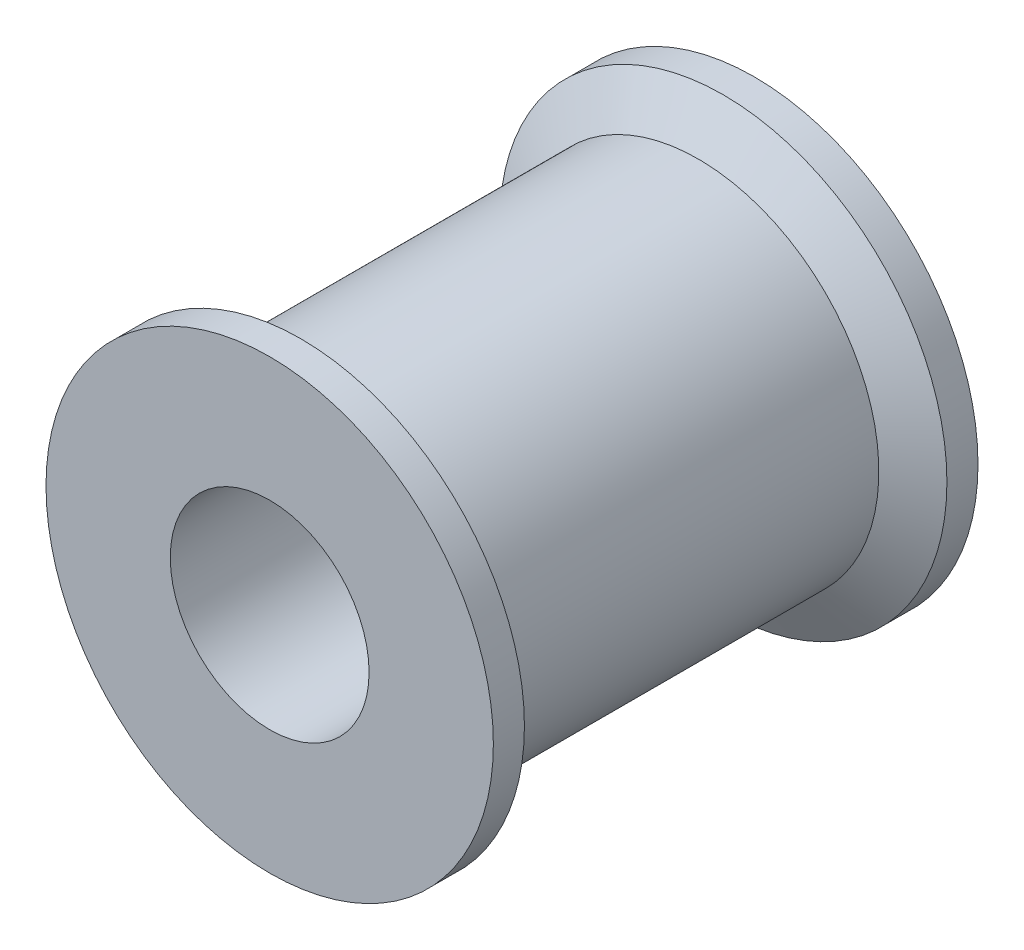
ISO-10303-21;
HEADER;
FILE_DESCRIPTION(('STEP AP214'),'2;1');
FILE_NAME('part.step','',(''),(''),'','','');
FILE_SCHEMA(('AUTOMOTIVE_DESIGN { 1 0 10303 214 1 1 1 1 }'));
ENDSEC;
DATA;
#1=APPLICATION_CONTEXT('core data for automotive mechanical design processes');
#2=APPLICATION_PROTOCOL_DEFINITION('international standard','automotive_design',2000,#1);
#3=PRODUCT_CONTEXT('',#1,'mechanical');
#4=PRODUCT('Part','Part','',(#3));
#5=PRODUCT_RELATED_PRODUCT_CATEGORY('part','',(#4));
#6=PRODUCT_DEFINITION_FORMATION('','',#4);
#7=PRODUCT_DEFINITION_CONTEXT('part definition',#1,'design');
#8=PRODUCT_DEFINITION('design','',#6,#7);
#9=PRODUCT_DEFINITION_SHAPE('','',#8);
#10=(LENGTH_UNIT() NAMED_UNIT(*) SI_UNIT(.MILLI.,.METRE.));
#11=(NAMED_UNIT(*) PLANE_ANGLE_UNIT() SI_UNIT($,.RADIAN.));
#12=(NAMED_UNIT(*) SI_UNIT($,.STERADIAN.) SOLID_ANGLE_UNIT());
#13=UNCERTAINTY_MEASURE_WITH_UNIT(LENGTH_MEASURE(1.E-05),#10,'distance_accuracy_value','');
#14=(GEOMETRIC_REPRESENTATION_CONTEXT(3) GLOBAL_UNCERTAINTY_ASSIGNED_CONTEXT((#13)) GLOBAL_UNIT_ASSIGNED_CONTEXT((#10,
#11,#12)) REPRESENTATION_CONTEXT('',''));
#15=CARTESIAN_POINT('',(0.,0.,0.));
#16=DIRECTION('',(0.,0.,1.));
#17=DIRECTION('',(1.,0.,0.));
#18=AXIS2_PLACEMENT_3D('',#15,#16,#17);
#19=CARTESIAN_POINT('',(0.,0.,23.75));
#20=DIRECTION('',(0.,0.,1.));
#21=DIRECTION('',(1.,0.,0.));
#22=AXIS2_PLACEMENT_3D('',#19,#20,#21);
#23=CONICAL_SURFACE('',#22,7.26,1.04917802969851);
#24=CARTESIAN_POINT('',(0.,0.,24.75));
#25=DIRECTION('',(0.,0.,-1.));
#26=DIRECTION('',(-1.,0.,0.));
#27=AXIS2_PLACEMENT_3D('',#24,#25,#26);
#28=CIRCLE('',#27,8.99999999999999);
#29=CARTESIAN_POINT('',(-8.99999999999999,0.,24.75));
#30=VERTEX_POINT('',#29);
#31=EDGE_CURVE('E10',#30,#30,#28,.T.);
#32=ORIENTED_EDGE('',*,*,#31,.T.);
#33=EDGE_LOOP('',(#32));
#34=FACE_BOUND('',#33,.T.);
#35=CARTESIAN_POINT('',(0.,0.,23.75));
#36=DIRECTION('',(0.,0.,-1.));
#37=DIRECTION('',(-1.,0.,0.));
#38=AXIS2_PLACEMENT_3D('',#35,#36,#37);
#39=CIRCLE('',#38,7.26);
#40=CARTESIAN_POINT('',(-7.26,0.,23.75));
#41=VERTEX_POINT('',#40);
#42=EDGE_CURVE('E55',#41,#41,#39,.T.);
#43=ORIENTED_EDGE('',*,*,#42,.F.);
#44=EDGE_LOOP('',(#43));
#45=FACE_BOUND('',#44,.T.);
#46=ADVANCED_FACE('F30',(#34,#45),#23,.T.);
#47=CARTESIAN_POINT('',(0.,0.,0.));
#48=DIRECTION('',(0.,0.,-1.));
#49=DIRECTION('',(-1.,0.,0.));
#50=AXIS2_PLACEMENT_3D('',#47,#48,#49);
#51=CYLINDRICAL_SURFACE('',#50,8.99999999999999);
#52=CARTESIAN_POINT('',(0.,0.,26.));
#53=DIRECTION('',(0.,0.,-1.));
#54=DIRECTION('',(-1.,0.,0.));
#55=AXIS2_PLACEMENT_3D('',#52,#53,#54);
#56=CIRCLE('',#55,9.);
#57=CARTESIAN_POINT('',(-9.,0.,26.));
#58=VERTEX_POINT('',#57);
#59=EDGE_CURVE('E36',#58,#58,#56,.T.);
#60=ORIENTED_EDGE('',*,*,#59,.T.);
#61=EDGE_LOOP('',(#60));
#62=FACE_BOUND('',#61,.T.);
#63=ORIENTED_EDGE('',*,*,#31,.F.);
#64=EDGE_LOOP('',(#63));
#65=FACE_BOUND('',#64,.T.);
#66=ADVANCED_FACE('F73',(#62,#65),#51,.T.);
#67=CARTESIAN_POINT('',(0.,9.,26.));
#68=DIRECTION('',(0.,0.,1.));
#69=DIRECTION('',(1.,0.,0.));
#70=AXIS2_PLACEMENT_3D('',#67,#68,#69);
#71=PLANE('',#70);
#72=CARTESIAN_POINT('',(0.,0.,26.));
#73=DIRECTION('',(0.,0.,-1.));
#74=DIRECTION('',(-1.,0.,0.));
#75=AXIS2_PLACEMENT_3D('',#72,#73,#74);
#76=CIRCLE('',#75,4.);
#77=CARTESIAN_POINT('',(-4.,0.,26.));
#78=VERTEX_POINT('',#77);
#79=EDGE_CURVE('E40',#78,#78,#76,.T.);
#80=ORIENTED_EDGE('',*,*,#79,.T.);
#81=EDGE_LOOP('',(#80));
#82=FACE_BOUND('',#81,.T.);
#83=ORIENTED_EDGE('',*,*,#59,.F.);
#84=EDGE_LOOP('',(#83));
#85=FACE_BOUND('',#84,.T.);
#86=ADVANCED_FACE('F67',(#82,#85),#71,.T.);
#87=CARTESIAN_POINT('',(0.,0.,0.));
#88=DIRECTION('',(0.,0.,-1.));
#89=DIRECTION('',(-1.,0.,0.));
#90=AXIS2_PLACEMENT_3D('',#87,#88,#89);
#91=CYLINDRICAL_SURFACE('',#90,4.);
#92=CARTESIAN_POINT('',(0.,0.,6.5));
#93=DIRECTION('',(0.,0.,1.));
#94=DIRECTION('',(1.,0.,0.));
#95=AXIS2_PLACEMENT_3D('',#92,#93,#94);
#96=CIRCLE('',#95,4.);
#97=CARTESIAN_POINT('',(4.,0.,6.5));
#98=VERTEX_POINT('',#97);
#99=EDGE_CURVE('E58',#98,#98,#96,.T.);
#100=ORIENTED_EDGE('',*,*,#99,.F.);
#101=EDGE_LOOP('',(#100));
#102=FACE_BOUND('',#101,.T.);
#103=ORIENTED_EDGE('',*,*,#79,.F.);
#104=EDGE_LOOP('',(#103));
#105=FACE_BOUND('',#104,.T.);
#106=ADVANCED_FACE('F64',(#102,#105),#91,.F.);
#107=CARTESIAN_POINT('',(0.,8.99999999999999,6.5));
#108=DIRECTION('',(0.,0.,-1.));
#109=DIRECTION('',(-1.,0.,0.));
#110=AXIS2_PLACEMENT_3D('',#107,#108,#109);
#111=PLANE('',#110);
#112=CARTESIAN_POINT('',(0.,0.,6.5));
#113=DIRECTION('',(0.,0.,-1.));
#114=DIRECTION('',(-1.,0.,0.));
#115=AXIS2_PLACEMENT_3D('',#112,#113,#114);
#116=CIRCLE('',#115,8.99999999999999);
#117=CARTESIAN_POINT('',(-8.99999999999999,0.,6.5));
#118=VERTEX_POINT('',#117);
#119=EDGE_CURVE('E44',#118,#118,#116,.T.);
#120=ORIENTED_EDGE('',*,*,#119,.T.);
#121=EDGE_LOOP('',(#120));
#122=FACE_BOUND('',#121,.T.);
#123=ORIENTED_EDGE('',*,*,#99,.T.);
#124=EDGE_LOOP('',(#123));
#125=FACE_BOUND('',#124,.T.);
#126=ADVANCED_FACE('F62',(#122,#125),#111,.T.);
#127=CARTESIAN_POINT('',(0.,0.,0.));
#128=DIRECTION('',(0.,0.,-1.));
#129=DIRECTION('',(-1.,0.,0.));
#130=AXIS2_PLACEMENT_3D('',#127,#128,#129);
#131=CYLINDRICAL_SURFACE('',#130,8.99999999999999);
#132=CARTESIAN_POINT('',(0.,0.,7.75));
#133=DIRECTION('',(0.,0.,-1.));
#134=DIRECTION('',(-1.,0.,0.));
#135=AXIS2_PLACEMENT_3D('',#132,#133,#134);
#136=CIRCLE('',#135,8.99999999999999);
#137=CARTESIAN_POINT('',(-8.99999999999999,0.,7.75));
#138=VERTEX_POINT('',#137);
#139=EDGE_CURVE('E49',#138,#138,#136,.T.);
#140=ORIENTED_EDGE('',*,*,#139,.T.);
#141=EDGE_LOOP('',(#140));
#142=FACE_BOUND('',#141,.T.);
#143=ORIENTED_EDGE('',*,*,#119,.F.);
#144=EDGE_LOOP('',(#143));
#145=FACE_BOUND('',#144,.T.);
#146=ADVANCED_FACE('F93',(#142,#145),#131,.T.);
#147=CARTESIAN_POINT('',(0.,0.,7.75));
#148=DIRECTION('',(0.,0.,-1.));
#149=DIRECTION('',(-1.,0.,0.));
#150=AXIS2_PLACEMENT_3D('',#147,#148,#149);
#151=CONICAL_SURFACE('',#150,8.99999999999999,1.04917802969851);
#152=CARTESIAN_POINT('',(0.,0.,8.75));
#153=DIRECTION('',(0.,0.,-1.));
#154=DIRECTION('',(-1.,0.,0.));
#155=AXIS2_PLACEMENT_3D('',#152,#153,#154);
#156=CIRCLE('',#155,7.26);
#157=CARTESIAN_POINT('',(-7.26,0.,8.75));
#158=VERTEX_POINT('',#157);
#159=EDGE_CURVE('E52',#158,#158,#156,.T.);
#160=ORIENTED_EDGE('',*,*,#159,.T.);
#161=EDGE_LOOP('',(#160));
#162=FACE_BOUND('',#161,.T.);
#163=ORIENTED_EDGE('',*,*,#139,.F.);
#164=EDGE_LOOP('',(#163));
#165=FACE_BOUND('',#164,.T.);
#166=ADVANCED_FACE('F87',(#162,#165),#151,.T.);
#167=CARTESIAN_POINT('',(0.,0.,0.));
#168=DIRECTION('',(0.,0.,-1.));
#169=DIRECTION('',(-1.,0.,0.));
#170=AXIS2_PLACEMENT_3D('',#167,#168,#169);
#171=CYLINDRICAL_SURFACE('',#170,7.26);
#172=ORIENTED_EDGE('',*,*,#42,.T.);
#173=EDGE_LOOP('',(#172));
#174=FACE_BOUND('',#173,.T.);
#175=ORIENTED_EDGE('',*,*,#159,.F.);
#176=EDGE_LOOP('',(#175));
#177=FACE_BOUND('',#176,.T.);
#178=ADVANCED_FACE('F84',(#174,#177),#171,.T.);
#179=CLOSED_SHELL('',(#46,#66,#86,#106,#126,#146,#166,#178));
#180=MANIFOLD_SOLID_BREP('B2',#179);
#181=ADVANCED_BREP_SHAPE_REPRESENTATION('',(#18,#180),#14);
#182=SHAPE_DEFINITION_REPRESENTATION(#9,#181);
ENDSEC;
END-ISO-10303-21;
